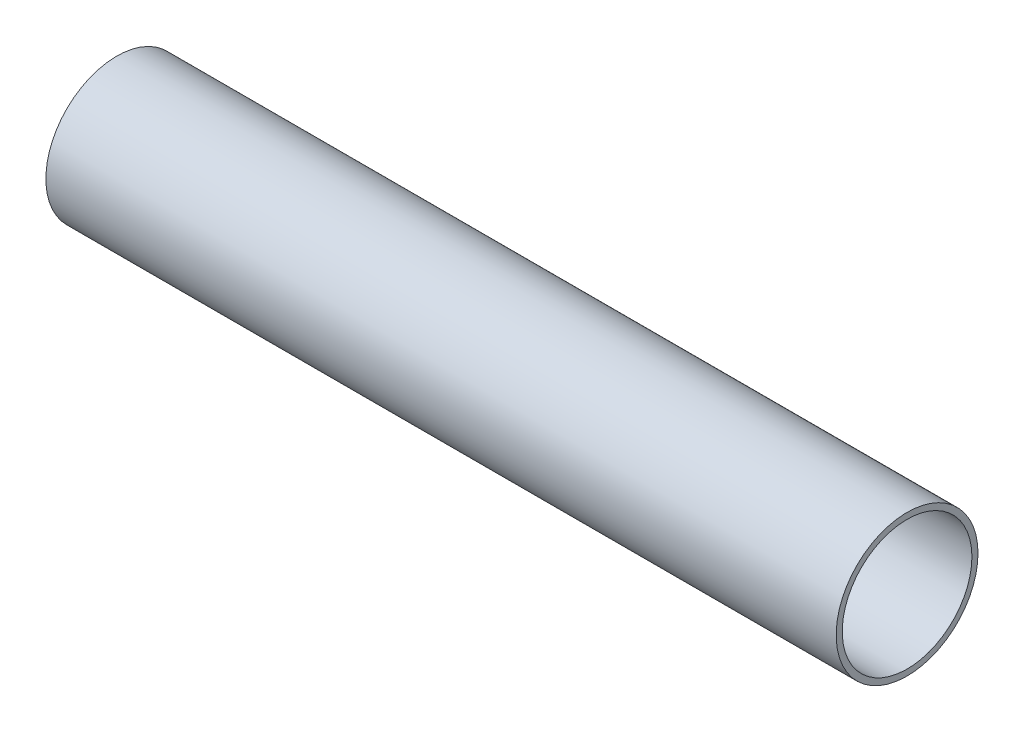
ISO-10303-21;
HEADER;
FILE_DESCRIPTION(('STEP AP214'),'2;1');
FILE_NAME('part.step','',(''),(''),'','','');
FILE_SCHEMA(('AUTOMOTIVE_DESIGN { 1 0 10303 214 1 1 1 1 }'));
ENDSEC;
DATA;
#1=APPLICATION_CONTEXT('core data for automotive mechanical design processes');
#2=APPLICATION_PROTOCOL_DEFINITION('international standard','automotive_design',2000,#1);
#3=PRODUCT_CONTEXT('',#1,'mechanical');
#4=PRODUCT('Part','Part','',(#3));
#5=PRODUCT_RELATED_PRODUCT_CATEGORY('part','',(#4));
#6=PRODUCT_DEFINITION_FORMATION('','',#4);
#7=PRODUCT_DEFINITION_CONTEXT('part definition',#1,'design');
#8=PRODUCT_DEFINITION('design','',#6,#7);
#9=PRODUCT_DEFINITION_SHAPE('','',#8);
#10=(LENGTH_UNIT() NAMED_UNIT(*) SI_UNIT(.MILLI.,.METRE.));
#11=(NAMED_UNIT(*) PLANE_ANGLE_UNIT() SI_UNIT($,.RADIAN.));
#12=(NAMED_UNIT(*) SI_UNIT($,.STERADIAN.) SOLID_ANGLE_UNIT());
#13=UNCERTAINTY_MEASURE_WITH_UNIT(LENGTH_MEASURE(1.E-05),#10,'distance_accuracy_value','');
#14=(GEOMETRIC_REPRESENTATION_CONTEXT(3) GLOBAL_UNCERTAINTY_ASSIGNED_CONTEXT((#13)) GLOBAL_UNIT_ASSIGNED_CONTEXT((#10,
#11,#12)) REPRESENTATION_CONTEXT('',''));
#15=CARTESIAN_POINT('',(0.,0.,0.));
#16=DIRECTION('',(0.,0.,1.));
#17=DIRECTION('',(1.,0.,0.));
#18=AXIS2_PLACEMENT_3D('',#15,#16,#17);
#19=CARTESIAN_POINT('',(-19.5,0.,0.));
#20=DIRECTION('',(1.,0.,0.));
#21=DIRECTION('',(0.,0.,-1.));
#22=AXIS2_PLACEMENT_3D('',#19,#20,#21);
#23=CYLINDRICAL_SURFACE('',#22,3.5);
#24=CARTESIAN_POINT('',(-19.5,0.,0.));
#25=DIRECTION('',(1.,0.,0.));
#26=DIRECTION('',(0.,0.,-1.));
#27=AXIS2_PLACEMENT_3D('',#24,#25,#26);
#28=CIRCLE('',#27,3.5);
#29=CARTESIAN_POINT('',(-19.5,0.,-3.5));
#30=VERTEX_POINT('',#29);
#31=EDGE_CURVE('E10',#30,#30,#28,.T.);
#32=ORIENTED_EDGE('',*,*,#31,.T.);
#33=EDGE_LOOP('',(#32));
#34=FACE_BOUND('',#33,.T.);
#35=CARTESIAN_POINT('',(19.5,0.,0.));
#36=DIRECTION('',(1.,0.,0.));
#37=DIRECTION('',(0.,0.,-1.));
#38=AXIS2_PLACEMENT_3D('',#35,#36,#37);
#39=CIRCLE('',#38,3.5);
#40=CARTESIAN_POINT('',(19.5,0.,-3.5));
#41=VERTEX_POINT('',#40);
#42=EDGE_CURVE('E40',#41,#41,#39,.T.);
#43=ORIENTED_EDGE('',*,*,#42,.F.);
#44=EDGE_LOOP('',(#43));
#45=FACE_BOUND('',#44,.T.);
#46=ADVANCED_FACE('F30',(#34,#45),#23,.T.);
#47=CARTESIAN_POINT('',(-19.5,0.,0.));
#48=DIRECTION('',(1.,0.,0.));
#49=DIRECTION('',(0.,0.,-1.));
#50=AXIS2_PLACEMENT_3D('',#47,#48,#49);
#51=PLANE('',#50);
#52=CARTESIAN_POINT('',(-19.5,0.,0.));
#53=DIRECTION('',(1.,0.,0.));
#54=DIRECTION('',(0.,0.,-1.));
#55=AXIS2_PLACEMENT_3D('',#52,#53,#54);
#56=CIRCLE('',#55,3.2);
#57=CARTESIAN_POINT('',(-19.5,0.,-3.2));
#58=VERTEX_POINT('',#57);
#59=EDGE_CURVE('E36',#58,#58,#56,.T.);
#60=ORIENTED_EDGE('',*,*,#59,.T.);
#61=EDGE_LOOP('',(#60));
#62=FACE_BOUND('',#61,.T.);
#63=ORIENTED_EDGE('',*,*,#31,.F.);
#64=EDGE_LOOP('',(#63));
#65=FACE_BOUND('',#64,.T.);
#66=ADVANCED_FACE('F59',(#62,#65),#51,.F.);
#67=CARTESIAN_POINT('',(-19.5,0.,0.));
#68=DIRECTION('',(1.,0.,0.));
#69=DIRECTION('',(0.,0.,-1.));
#70=AXIS2_PLACEMENT_3D('',#67,#68,#69);
#71=CYLINDRICAL_SURFACE('',#70,3.2);
#72=ORIENTED_EDGE('',*,*,#59,.F.);
#73=EDGE_LOOP('',(#72));
#74=FACE_BOUND('',#73,.T.);
#75=CARTESIAN_POINT('',(19.5,0.,0.));
#76=DIRECTION('',(1.,0.,0.));
#77=DIRECTION('',(0.,0.,-1.));
#78=AXIS2_PLACEMENT_3D('',#75,#76,#77);
#79=CIRCLE('',#78,3.2);
#80=CARTESIAN_POINT('',(19.5,0.,-3.2));
#81=VERTEX_POINT('',#80);
#82=EDGE_CURVE('E44',#81,#81,#79,.T.);
#83=ORIENTED_EDGE('',*,*,#82,.T.);
#84=EDGE_LOOP('',(#83));
#85=FACE_BOUND('',#84,.T.);
#86=ADVANCED_FACE('F50',(#74,#85),#71,.F.);
#87=CARTESIAN_POINT('',(19.5,0.,0.));
#88=DIRECTION('',(1.,0.,0.));
#89=DIRECTION('',(0.,0.,-1.));
#90=AXIS2_PLACEMENT_3D('',#87,#88,#89);
#91=PLANE('',#90);
#92=ORIENTED_EDGE('',*,*,#42,.T.);
#93=EDGE_LOOP('',(#92));
#94=FACE_BOUND('',#93,.T.);
#95=ORIENTED_EDGE('',*,*,#82,.F.);
#96=EDGE_LOOP('',(#95));
#97=FACE_BOUND('',#96,.T.);
#98=ADVANCED_FACE('F52',(#94,#97),#91,.T.);
#99=CLOSED_SHELL('',(#46,#66,#86,#98));
#100=MANIFOLD_SOLID_BREP('B2',#99);
#101=ADVANCED_BREP_SHAPE_REPRESENTATION('',(#18,#100),#14);
#102=SHAPE_DEFINITION_REPRESENTATION(#9,#101);
ENDSEC;
END-ISO-10303-21;
